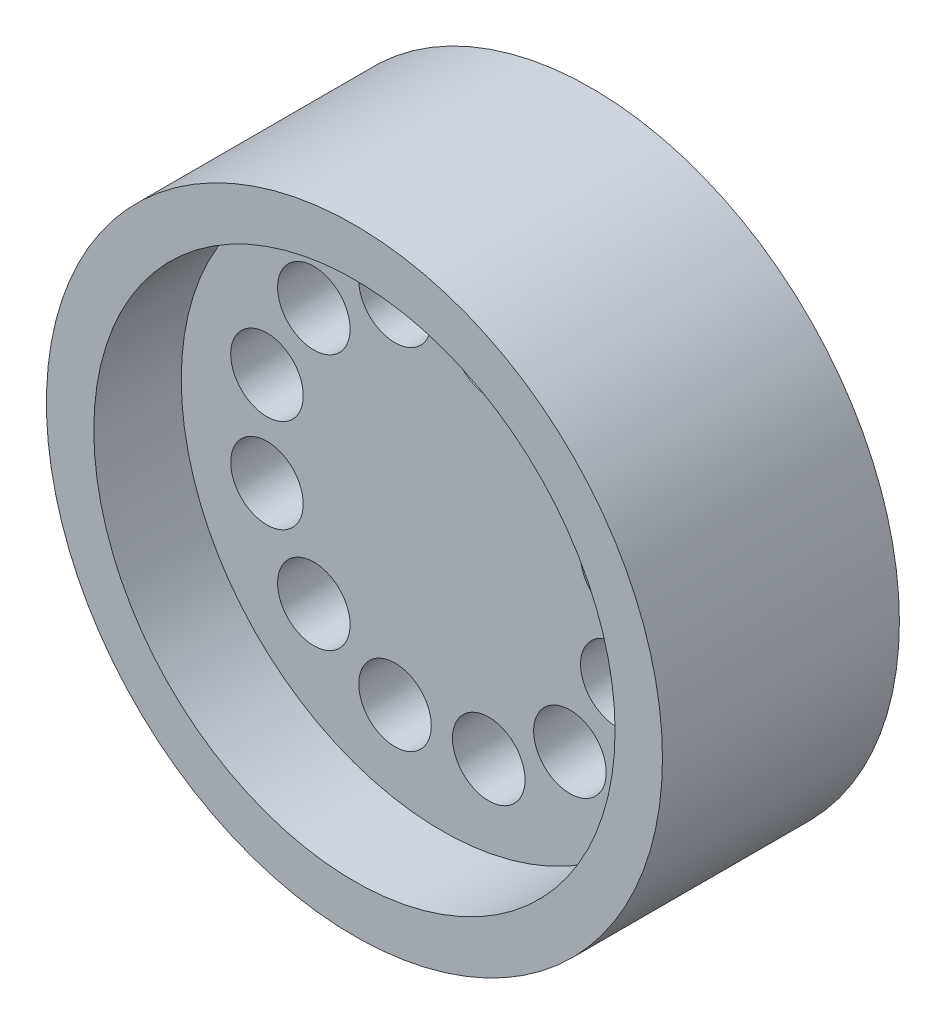
ISO-10303-21;
HEADER;
FILE_DESCRIPTION(('STEP AP214'),'2;1');
FILE_NAME('part.step','',(''),(''),'','','');
FILE_SCHEMA(('AUTOMOTIVE_DESIGN { 1 0 10303 214 1 1 1 1 }'));
ENDSEC;
DATA;
#1=APPLICATION_CONTEXT('core data for automotive mechanical design processes');
#2=APPLICATION_PROTOCOL_DEFINITION('international standard','automotive_design',2000,#1);
#3=PRODUCT_CONTEXT('',#1,'mechanical');
#4=PRODUCT('Part','Part','',(#3));
#5=PRODUCT_RELATED_PRODUCT_CATEGORY('part','',(#4));
#6=PRODUCT_DEFINITION_FORMATION('','',#4);
#7=PRODUCT_DEFINITION_CONTEXT('part definition',#1,'design');
#8=PRODUCT_DEFINITION('design','',#6,#7);
#9=PRODUCT_DEFINITION_SHAPE('','',#8);
#10=(LENGTH_UNIT() NAMED_UNIT(*) SI_UNIT(.MILLI.,.METRE.));
#11=(NAMED_UNIT(*) PLANE_ANGLE_UNIT() SI_UNIT($,.RADIAN.));
#12=(NAMED_UNIT(*) SI_UNIT($,.STERADIAN.) SOLID_ANGLE_UNIT());
#13=UNCERTAINTY_MEASURE_WITH_UNIT(LENGTH_MEASURE(1.E-05),#10,'distance_accuracy_value','');
#14=(GEOMETRIC_REPRESENTATION_CONTEXT(3) GLOBAL_UNCERTAINTY_ASSIGNED_CONTEXT((#13)) GLOBAL_UNIT_ASSIGNED_CONTEXT((#10,
#11,#12)) REPRESENTATION_CONTEXT('',''));
#15=CARTESIAN_POINT('',(0.,0.,0.));
#16=DIRECTION('',(0.,0.,1.));
#17=DIRECTION('',(1.,0.,0.));
#18=AXIS2_PLACEMENT_3D('',#15,#16,#17);
#19=CARTESIAN_POINT('',(0.,-13.75,14.4329896907217));
#20=DIRECTION('',(0.,0.,1.));
#21=DIRECTION('',(1.,0.,0.));
#22=AXIS2_PLACEMENT_3D('',#19,#20,#21);
#23=CYLINDRICAL_SURFACE('',#22,27.5);
#24=CARTESIAN_POINT('',(0.,-13.75,2.88659793814432));
#25=DIRECTION('',(0.,0.,1.));
#26=DIRECTION('',(1.,0.,0.));
#27=AXIS2_PLACEMENT_3D('',#24,#25,#26);
#28=CIRCLE('',#27,27.5);
#29=CARTESIAN_POINT('',(27.5,-13.75,2.88659793814432));
#30=VERTEX_POINT('',#29);
#31=EDGE_CURVE('E42',#30,#30,#28,.T.);
#32=ORIENTED_EDGE('',*,*,#31,.F.);
#33=EDGE_LOOP('',(#32));
#34=FACE_BOUND('',#33,.T.);
#35=CARTESIAN_POINT('',(0.,-13.75,12.1134020618557));
#36=DIRECTION('',(0.,0.,1.));
#37=DIRECTION('',(1.,0.,0.));
#38=AXIS2_PLACEMENT_3D('',#35,#36,#37);
#39=CIRCLE('',#38,27.5);
#40=CARTESIAN_POINT('',(27.5,-13.75,12.1134020618557));
#41=VERTEX_POINT('',#40);
#42=EDGE_CURVE('E61',#41,#41,#39,.T.);
#43=ORIENTED_EDGE('',*,*,#42,.T.);
#44=EDGE_LOOP('',(#43));
#45=FACE_BOUND('',#44,.T.);
#46=ADVANCED_FACE('F35',(#34,#45),#23,.F.);
#47=CARTESIAN_POINT('',(0.,0.,2.88659793814431));
#48=DIRECTION('',(0.,0.,1.));
#49=DIRECTION('',(1.,0.,0.));
#50=AXIS2_PLACEMENT_3D('',#47,#48,#49);
#51=PLANE('',#50);
#52=CARTESIAN_POINT('',(-13.5105738901882,-0.239426109811574,2.88659793814431));
#53=DIRECTION('',(0.,0.,1.));
#54=DIRECTION('',(1.,0.,0.));
#55=AXIS2_PLACEMENT_3D('',#52,#53,#54);
#56=CIRCLE('',#55,3.82719253221743);
#57=CARTESIAN_POINT('',(-9.68338135797081,-0.239426109811574,2.88659793814431));
#58=VERTEX_POINT('',#57);
#59=EDGE_CURVE('E64',#58,#58,#56,.T.);
#60=ORIENTED_EDGE('',*,*,#59,.F.);
#61=EDGE_LOOP('',(#60));
#62=FACE_BOUND('',#61,.T.);
#63=CARTESIAN_POINT('',(-18.455787153704,-8.80478673648423,2.88659793814431));
#64=DIRECTION('',(0.,0.,1.));
#65=DIRECTION('',(1.,0.,0.));
#66=AXIS2_PLACEMENT_3D('',#63,#64,#65);
#67=CIRCLE('',#66,3.82719253221743);
#68=CARTESIAN_POINT('',(-14.6285946214866,-8.80478673648423,2.88659793814431));
#69=VERTEX_POINT('',#68);
#70=EDGE_CURVE('E67',#69,#69,#67,.T.);
#71=ORIENTED_EDGE('',*,*,#70,.F.);
#72=EDGE_LOOP('',(#71));
#73=FACE_BOUND('',#72,.T.);
#74=CARTESIAN_POINT('',(-18.455787153704,-18.6952132635158,2.88659793814431));
#75=DIRECTION('',(0.,0.,1.));
#76=DIRECTION('',(1.,0.,0.));
#77=AXIS2_PLACEMENT_3D('',#74,#75,#76);
#78=CIRCLE('',#77,3.82719253221743);
#79=CARTESIAN_POINT('',(-14.6285946214866,-18.6952132635158,2.88659793814431));
#80=VERTEX_POINT('',#79);
#81=EDGE_CURVE('E70',#80,#80,#78,.T.);
#82=ORIENTED_EDGE('',*,*,#81,.F.);
#83=EDGE_LOOP('',(#82));
#84=FACE_BOUND('',#83,.T.);
#85=CARTESIAN_POINT('',(-13.5105738901882,-27.2605738901884,2.88659793814431));
#86=DIRECTION('',(0.,0.,1.));
#87=DIRECTION('',(1.,0.,0.));
#88=AXIS2_PLACEMENT_3D('',#85,#86,#87);
#89=CIRCLE('',#88,3.82719253221743);
#90=CARTESIAN_POINT('',(-9.68338135797081,-27.2605738901884,2.88659793814431));
#91=VERTEX_POINT('',#90);
#92=EDGE_CURVE('E73',#91,#91,#89,.T.);
#93=ORIENTED_EDGE('',*,*,#92,.F.);
#94=EDGE_LOOP('',(#93));
#95=FACE_BOUND('',#94,.T.);
#96=CARTESIAN_POINT('',(-4.94521326351555,-32.205787153704,2.88659793814431));
#97=DIRECTION('',(0.,0.,1.));
#98=DIRECTION('',(1.,0.,0.));
#99=AXIS2_PLACEMENT_3D('',#96,#97,#98);
#100=CIRCLE('',#99,3.82719253221744);
#101=CARTESIAN_POINT('',(-1.11802073129812,-32.205787153704,2.88659793814431));
#102=VERTEX_POINT('',#101);
#103=EDGE_CURVE('E76',#102,#102,#100,.T.);
#104=ORIENTED_EDGE('',*,*,#103,.F.);
#105=EDGE_LOOP('',(#104));
#106=FACE_BOUND('',#105,.T.);
#107=CARTESIAN_POINT('',(4.94521326351555,-32.205787153704,2.88659793814431));
#108=DIRECTION('',(0.,0.,1.));
#109=DIRECTION('',(1.,0.,0.));
#110=AXIS2_PLACEMENT_3D('',#107,#108,#109);
#111=CIRCLE('',#110,3.82719253221744);
#112=CARTESIAN_POINT('',(8.77240579573299,-32.205787153704,2.88659793814431));
#113=VERTEX_POINT('',#112);
#114=EDGE_CURVE('E79',#113,#113,#111,.T.);
#115=ORIENTED_EDGE('',*,*,#114,.F.);
#116=EDGE_LOOP('',(#115));
#117=FACE_BOUND('',#116,.T.);
#118=CARTESIAN_POINT('',(13.5105738901882,-27.2605738901884,2.88659793814431));
#119=DIRECTION('',(0.,0.,1.));
#120=DIRECTION('',(1.,0.,0.));
#121=AXIS2_PLACEMENT_3D('',#118,#119,#120);
#122=CIRCLE('',#121,3.82719253221743);
#123=CARTESIAN_POINT('',(17.3377664224057,-27.2605738901884,2.88659793814431));
#124=VERTEX_POINT('',#123);
#125=EDGE_CURVE('E82',#124,#124,#122,.T.);
#126=ORIENTED_EDGE('',*,*,#125,.F.);
#127=EDGE_LOOP('',(#126));
#128=FACE_BOUND('',#127,.T.);
#129=CARTESIAN_POINT('',(18.455787153704,-18.6952132635158,2.88659793814431));
#130=DIRECTION('',(0.,0.,1.));
#131=DIRECTION('',(1.,0.,0.));
#132=AXIS2_PLACEMENT_3D('',#129,#130,#131);
#133=CIRCLE('',#132,3.82719253221743);
#134=CARTESIAN_POINT('',(22.2829796859214,-18.6952132635158,2.88659793814431));
#135=VERTEX_POINT('',#134);
#136=EDGE_CURVE('E85',#135,#135,#133,.T.);
#137=ORIENTED_EDGE('',*,*,#136,.F.);
#138=EDGE_LOOP('',(#137));
#139=FACE_BOUND('',#138,.T.);
#140=CARTESIAN_POINT('',(18.455787153704,-8.80478673648423,2.88659793814431));
#141=DIRECTION('',(0.,0.,1.));
#142=DIRECTION('',(1.,0.,0.));
#143=AXIS2_PLACEMENT_3D('',#140,#141,#142);
#144=CIRCLE('',#143,3.82719253221743);
#145=CARTESIAN_POINT('',(22.2829796859214,-8.80478673648423,2.88659793814431));
#146=VERTEX_POINT('',#145);
#147=EDGE_CURVE('E88',#146,#146,#144,.T.);
#148=ORIENTED_EDGE('',*,*,#147,.F.);
#149=EDGE_LOOP('',(#148));
#150=FACE_BOUND('',#149,.T.);
#151=CARTESIAN_POINT('',(13.5105738901882,-0.239426109811574,2.88659793814431));
#152=DIRECTION('',(0.,0.,1.));
#153=DIRECTION('',(1.,0.,0.));
#154=AXIS2_PLACEMENT_3D('',#151,#152,#153);
#155=CIRCLE('',#154,3.82719253221743);
#156=CARTESIAN_POINT('',(17.3377664224057,-0.239426109811574,2.88659793814431));
#157=VERTEX_POINT('',#156);
#158=EDGE_CURVE('E91',#157,#157,#155,.T.);
#159=ORIENTED_EDGE('',*,*,#158,.F.);
#160=EDGE_LOOP('',(#159));
#161=FACE_BOUND('',#160,.T.);
#162=CARTESIAN_POINT('',(4.94521326351555,4.70578715370405,2.88659793814431));
#163=DIRECTION('',(0.,0.,1.));
#164=DIRECTION('',(1.,0.,0.));
#165=AXIS2_PLACEMENT_3D('',#162,#163,#164);
#166=CIRCLE('',#165,3.82719253221744);
#167=CARTESIAN_POINT('',(8.77240579573299,4.70578715370405,2.88659793814431));
#168=VERTEX_POINT('',#167);
#169=EDGE_CURVE('E94',#168,#168,#166,.T.);
#170=ORIENTED_EDGE('',*,*,#169,.F.);
#171=EDGE_LOOP('',(#170));
#172=FACE_BOUND('',#171,.T.);
#173=CARTESIAN_POINT('',(-4.94521326351555,4.70578715370405,2.88659793814431));
#174=DIRECTION('',(0.,0.,1.));
#175=DIRECTION('',(1.,0.,0.));
#176=AXIS2_PLACEMENT_3D('',#173,#174,#175);
#177=CIRCLE('',#176,3.82719253221744);
#178=CARTESIAN_POINT('',(-1.11802073129812,4.70578715370405,2.88659793814431));
#179=VERTEX_POINT('',#178);
#180=EDGE_CURVE('E97',#179,#179,#177,.T.);
#181=ORIENTED_EDGE('',*,*,#180,.F.);
#182=EDGE_LOOP('',(#181));
#183=FACE_BOUND('',#182,.T.);
#184=ORIENTED_EDGE('',*,*,#31,.T.);
#185=EDGE_LOOP('',(#184));
#186=FACE_BOUND('',#185,.T.);
#187=ADVANCED_FACE('F37',(#62,#73,#84,#95,#106,#117,#128,#139,#150,#161,#172,#183,#186),#51,.T.);
#188=CARTESIAN_POINT('',(0.,0.,-2.88659793814432));
#189=DIRECTION('',(0.,0.,1.));
#190=DIRECTION('',(1.,0.,0.));
#191=AXIS2_PLACEMENT_3D('',#188,#189,#190);
#192=PLANE('',#191);
#193=CARTESIAN_POINT('',(0.,-13.75,-2.88659793814432));
#194=DIRECTION('',(0.,0.,1.));
#195=DIRECTION('',(1.,0.,0.));
#196=AXIS2_PLACEMENT_3D('',#193,#194,#195);
#197=CIRCLE('',#196,2.5);
#198=CARTESIAN_POINT('',(2.5,-13.75,-2.88659793814432));
#199=VERTEX_POINT('',#198);
#200=EDGE_CURVE('E10',#199,#199,#197,.F.);
#201=ORIENTED_EDGE('',*,*,#200,.F.);
#202=EDGE_LOOP('',(#201));
#203=FACE_BOUND('',#202,.T.);
#204=CARTESIAN_POINT('',(-13.5105738901882,-0.239426109811574,-2.88659793814432));
#205=DIRECTION('',(0.,0.,-1.));
#206=DIRECTION('',(1.,0.,0.));
#207=AXIS2_PLACEMENT_3D('',#204,#205,#206);
#208=CIRCLE('',#207,3.82719253221743);
#209=CARTESIAN_POINT('',(-9.68338135797081,-0.239426109811574,-2.88659793814432));
#210=VERTEX_POINT('',#209);
#211=EDGE_CURVE('E103',#210,#210,#208,.T.);
#212=ORIENTED_EDGE('',*,*,#211,.F.);
#213=EDGE_LOOP('',(#212));
#214=FACE_BOUND('',#213,.T.);
#215=CARTESIAN_POINT('',(-18.455787153704,-8.80478673648423,-2.88659793814432));
#216=DIRECTION('',(0.,0.,-1.));
#217=DIRECTION('',(-1.,0.,0.));
#218=AXIS2_PLACEMENT_3D('',#215,#216,#217);
#219=CIRCLE('',#218,3.82719253221743);
#220=CARTESIAN_POINT('',(-22.2829796859214,-8.80478673648423,-2.88659793814432));
#221=VERTEX_POINT('',#220);
#222=EDGE_CURVE('E123',#221,#221,#219,.T.);
#223=ORIENTED_EDGE('',*,*,#222,.F.);
#224=EDGE_LOOP('',(#223));
#225=FACE_BOUND('',#224,.T.);
#226=CARTESIAN_POINT('',(-18.455787153704,-18.6952132635158,-2.88659793814432));
#227=DIRECTION('',(0.,0.,-1.));
#228=DIRECTION('',(1.,0.,0.));
#229=AXIS2_PLACEMENT_3D('',#226,#227,#228);
#230=CIRCLE('',#229,3.82719253221743);
#231=CARTESIAN_POINT('',(-14.6285946214866,-18.6952132635158,-2.88659793814432));
#232=VERTEX_POINT('',#231);
#233=EDGE_CURVE('E120',#232,#232,#230,.T.);
#234=ORIENTED_EDGE('',*,*,#233,.F.);
#235=EDGE_LOOP('',(#234));
#236=FACE_BOUND('',#235,.T.);
#237=CARTESIAN_POINT('',(-13.5105738901882,-27.2605738901884,-2.88659793814432));
#238=DIRECTION('',(0.,0.,-1.));
#239=DIRECTION('',(-1.,0.,0.));
#240=AXIS2_PLACEMENT_3D('',#237,#238,#239);
#241=CIRCLE('',#240,3.82719253221743);
#242=CARTESIAN_POINT('',(-17.3377664224057,-27.2605738901884,-2.88659793814432));
#243=VERTEX_POINT('',#242);
#244=EDGE_CURVE('E117',#243,#243,#241,.T.);
#245=ORIENTED_EDGE('',*,*,#244,.F.);
#246=EDGE_LOOP('',(#245));
#247=FACE_BOUND('',#246,.T.);
#248=CARTESIAN_POINT('',(-4.94521326351555,-32.205787153704,-2.88659793814432));
#249=DIRECTION('',(0.,0.,-1.));
#250=DIRECTION('',(1.,0.,0.));
#251=AXIS2_PLACEMENT_3D('',#248,#249,#250);
#252=CIRCLE('',#251,3.82719253221744);
#253=CARTESIAN_POINT('',(-1.11802073129812,-32.205787153704,-2.88659793814432));
#254=VERTEX_POINT('',#253);
#255=EDGE_CURVE('E114',#254,#254,#252,.T.);
#256=ORIENTED_EDGE('',*,*,#255,.F.);
#257=EDGE_LOOP('',(#256));
#258=FACE_BOUND('',#257,.T.);
#259=CARTESIAN_POINT('',(4.94521326351555,-32.205787153704,-2.88659793814432));
#260=DIRECTION('',(0.,0.,-1.));
#261=DIRECTION('',(-1.,0.,0.));
#262=AXIS2_PLACEMENT_3D('',#259,#260,#261);
#263=CIRCLE('',#262,3.82719253221744);
#264=CARTESIAN_POINT('',(1.11802073129812,-32.205787153704,-2.88659793814432));
#265=VERTEX_POINT('',#264);
#266=EDGE_CURVE('E111',#265,#265,#263,.T.);
#267=ORIENTED_EDGE('',*,*,#266,.F.);
#268=EDGE_LOOP('',(#267));
#269=FACE_BOUND('',#268,.T.);
#270=CARTESIAN_POINT('',(13.5105738901882,-27.2605738901884,-2.88659793814432));
#271=DIRECTION('',(0.,0.,-1.));
#272=DIRECTION('',(1.,0.,0.));
#273=AXIS2_PLACEMENT_3D('',#270,#271,#272);
#274=CIRCLE('',#273,3.82719253221743);
#275=CARTESIAN_POINT('',(17.3377664224057,-27.2605738901884,-2.88659793814432));
#276=VERTEX_POINT('',#275);
#277=EDGE_CURVE('E107',#276,#276,#274,.T.);
#278=ORIENTED_EDGE('',*,*,#277,.F.);
#279=EDGE_LOOP('',(#278));
#280=FACE_BOUND('',#279,.T.);
#281=CARTESIAN_POINT('',(18.455787153704,-18.6952132635158,-2.88659793814432));
#282=DIRECTION('',(0.,0.,-1.));
#283=DIRECTION('',(-1.,0.,0.));
#284=AXIS2_PLACEMENT_3D('',#281,#282,#283);
#285=CIRCLE('',#284,3.82719253221743);
#286=CARTESIAN_POINT('',(14.6285946214866,-18.6952132635158,-2.88659793814432));
#287=VERTEX_POINT('',#286);
#288=EDGE_CURVE('E104',#287,#287,#285,.T.);
#289=ORIENTED_EDGE('',*,*,#288,.F.);
#290=EDGE_LOOP('',(#289));
#291=FACE_BOUND('',#290,.T.);
#292=CARTESIAN_POINT('',(18.455787153704,-8.80478673648423,-2.88659793814432));
#293=DIRECTION('',(0.,0.,-1.));
#294=DIRECTION('',(1.,0.,0.));
#295=AXIS2_PLACEMENT_3D('',#292,#293,#294);
#296=CIRCLE('',#295,3.82719253221743);
#297=CARTESIAN_POINT('',(22.2829796859214,-8.80478673648423,-2.88659793814432));
#298=VERTEX_POINT('',#297);
#299=EDGE_CURVE('E108',#298,#298,#296,.T.);
#300=ORIENTED_EDGE('',*,*,#299,.F.);
#301=EDGE_LOOP('',(#300));
#302=FACE_BOUND('',#301,.T.);
#303=CARTESIAN_POINT('',(13.5105738901882,-0.239426109811574,-2.88659793814432));
#304=DIRECTION('',(0.,0.,-1.));
#305=DIRECTION('',(-1.,0.,0.));
#306=AXIS2_PLACEMENT_3D('',#303,#304,#305);
#307=CIRCLE('',#306,3.82719253221743);
#308=CARTESIAN_POINT('',(9.68338135797081,-0.239426109811574,-2.88659793814432));
#309=VERTEX_POINT('',#308);
#310=EDGE_CURVE('E131',#309,#309,#307,.T.);
#311=ORIENTED_EDGE('',*,*,#310,.F.);
#312=EDGE_LOOP('',(#311));
#313=FACE_BOUND('',#312,.T.);
#314=CARTESIAN_POINT('',(4.94521326351555,4.70578715370405,-2.88659793814432));
#315=DIRECTION('',(0.,0.,-1.));
#316=DIRECTION('',(1.,0.,0.));
#317=AXIS2_PLACEMENT_3D('',#314,#315,#316);
#318=CIRCLE('',#317,3.82719253221744);
#319=CARTESIAN_POINT('',(8.77240579573299,4.70578715370405,-2.88659793814432));
#320=VERTEX_POINT('',#319);
#321=EDGE_CURVE('E128',#320,#320,#318,.T.);
#322=ORIENTED_EDGE('',*,*,#321,.F.);
#323=EDGE_LOOP('',(#322));
#324=FACE_BOUND('',#323,.T.);
#325=CARTESIAN_POINT('',(-4.94521326351555,4.70578715370405,-2.88659793814432));
#326=DIRECTION('',(0.,0.,-1.));
#327=DIRECTION('',(-1.,0.,0.));
#328=AXIS2_PLACEMENT_3D('',#325,#326,#327);
#329=CIRCLE('',#328,3.82719253221744);
#330=CARTESIAN_POINT('',(-8.77240579573299,4.70578715370405,-2.88659793814432));
#331=VERTEX_POINT('',#330);
#332=EDGE_CURVE('E100',#331,#331,#329,.T.);
#333=ORIENTED_EDGE('',*,*,#332,.F.);
#334=EDGE_LOOP('',(#333));
#335=FACE_BOUND('',#334,.T.);
#336=CARTESIAN_POINT('',(0.,-13.75,-2.88659793814432));
#337=DIRECTION('',(0.,0.,1.));
#338=DIRECTION('',(1.,0.,0.));
#339=AXIS2_PLACEMENT_3D('',#336,#337,#338);
#340=CIRCLE('',#339,27.5);
#341=CARTESIAN_POINT('',(27.5,-13.75,-2.88659793814432));
#342=VERTEX_POINT('',#341);
#343=EDGE_CURVE('E46',#342,#342,#340,.T.);
#344=ORIENTED_EDGE('',*,*,#343,.F.);
#345=EDGE_LOOP('',(#344));
#346=FACE_BOUND('',#345,.T.);
#347=ADVANCED_FACE('F162',(#203,#214,#225,#236,#247,#258,#269,#280,#291,#302,#313,#324,#335,
#346),#192,.F.);
#348=CARTESIAN_POINT('',(0.,-13.75,-12.8865979381443));
#349=DIRECTION('',(0.,0.,1.));
#350=DIRECTION('',(1.,0.,0.));
#351=AXIS2_PLACEMENT_3D('',#348,#349,#350);
#352=CIRCLE('',#351,27.5);
#353=CARTESIAN_POINT('',(27.5,-13.75,-12.8865979381443));
#354=VERTEX_POINT('',#353);
#355=EDGE_CURVE('E50',#354,#354,#352,.T.);
#356=ORIENTED_EDGE('',*,*,#355,.F.);
#357=EDGE_LOOP('',(#356));
#358=FACE_BOUND('',#357,.T.);
#359=ORIENTED_EDGE('',*,*,#343,.T.);
#360=EDGE_LOOP('',(#359));
#361=FACE_BOUND('',#360,.T.);
#362=ADVANCED_FACE('F158',(#358,#361),#23,.F.);
#363=CARTESIAN_POINT('',(0.,0.,-12.8865979381443));
#364=DIRECTION('',(0.,0.,1.));
#365=DIRECTION('',(1.,0.,0.));
#366=AXIS2_PLACEMENT_3D('',#363,#364,#365);
#367=PLANE('',#366);
#368=CARTESIAN_POINT('',(0.,-13.75,-12.8865979381443));
#369=DIRECTION('',(0.,0.,1.));
#370=DIRECTION('',(1.,0.,0.));
#371=AXIS2_PLACEMENT_3D('',#368,#369,#370);
#372=CIRCLE('',#371,32.5);
#373=CARTESIAN_POINT('',(32.5,-13.75,-12.8865979381443));
#374=VERTEX_POINT('',#373);
#375=EDGE_CURVE('E55',#374,#374,#372,.T.);
#376=ORIENTED_EDGE('',*,*,#375,.F.);
#377=EDGE_LOOP('',(#376));
#378=FACE_BOUND('',#377,.T.);
#379=ORIENTED_EDGE('',*,*,#355,.T.);
#380=EDGE_LOOP('',(#379));
#381=FACE_BOUND('',#380,.T.);
#382=ADVANCED_FACE('F167',(#378,#381),#367,.F.);
#383=CARTESIAN_POINT('',(0.,-13.75,14.4329896907217));
#384=DIRECTION('',(0.,0.,1.));
#385=DIRECTION('',(1.,0.,0.));
#386=AXIS2_PLACEMENT_3D('',#383,#384,#385);
#387=CYLINDRICAL_SURFACE('',#386,32.5);
#388=ORIENTED_EDGE('',*,*,#375,.T.);
#389=EDGE_LOOP('',(#388));
#390=FACE_BOUND('',#389,.T.);
#391=CARTESIAN_POINT('',(0.,-13.75,12.1134020618557));
#392=DIRECTION('',(0.,0.,1.));
#393=DIRECTION('',(1.,0.,0.));
#394=AXIS2_PLACEMENT_3D('',#391,#392,#393);
#395=CIRCLE('',#394,32.5);
#396=CARTESIAN_POINT('',(32.5,-13.75,12.1134020618557));
#397=VERTEX_POINT('',#396);
#398=EDGE_CURVE('E58',#397,#397,#395,.T.);
#399=ORIENTED_EDGE('',*,*,#398,.F.);
#400=EDGE_LOOP('',(#399));
#401=FACE_BOUND('',#400,.T.);
#402=ADVANCED_FACE('F173',(#390,#401),#387,.T.);
#403=CARTESIAN_POINT('',(0.,0.,12.1134020618557));
#404=DIRECTION('',(0.,0.,1.));
#405=DIRECTION('',(1.,0.,0.));
#406=AXIS2_PLACEMENT_3D('',#403,#404,#405);
#407=PLANE('',#406);
#408=ORIENTED_EDGE('',*,*,#398,.T.);
#409=EDGE_LOOP('',(#408));
#410=FACE_BOUND('',#409,.T.);
#411=ORIENTED_EDGE('',*,*,#42,.F.);
#412=EDGE_LOOP('',(#411));
#413=FACE_BOUND('',#412,.T.);
#414=ADVANCED_FACE('F211',(#410,#413),#407,.T.);
#415=CARTESIAN_POINT('',(-4.94521326351555,4.70578715370405,7.11340206185568));
#416=DIRECTION('',(0.,0.,-1.));
#417=DIRECTION('',(-1.,0.,0.));
#418=AXIS2_PLACEMENT_3D('',#415,#416,#417);
#419=CYLINDRICAL_SURFACE('',#418,3.82719253221744);
#420=ORIENTED_EDGE('',*,*,#180,.T.);
#421=EDGE_LOOP('',(#420));
#422=FACE_BOUND('',#421,.T.);
#423=ORIENTED_EDGE('',*,*,#332,.T.);
#424=EDGE_LOOP('',(#423));
#425=FACE_BOUND('',#424,.T.);
#426=ADVANCED_FACE('F208',(#422,#425),#419,.F.);
#427=CARTESIAN_POINT('',(4.94521326351555,4.70578715370405,7.11340206185568));
#428=DIRECTION('',(0.,0.,-1.));
#429=DIRECTION('',(-1.,0.,0.));
#430=AXIS2_PLACEMENT_3D('',#427,#428,#429);
#431=CYLINDRICAL_SURFACE('',#430,3.82719253221744);
#432=ORIENTED_EDGE('',*,*,#169,.T.);
#433=EDGE_LOOP('',(#432));
#434=FACE_BOUND('',#433,.T.);
#435=ORIENTED_EDGE('',*,*,#321,.T.);
#436=EDGE_LOOP('',(#435));
#437=FACE_BOUND('',#436,.T.);
#438=ADVANCED_FACE('F210',(#434,#437),#431,.F.);
#439=CARTESIAN_POINT('',(13.5105738901882,-0.239426109811574,7.11340206185568));
#440=DIRECTION('',(0.,0.,-1.));
#441=DIRECTION('',(-1.,0.,0.));
#442=AXIS2_PLACEMENT_3D('',#439,#440,#441);
#443=CYLINDRICAL_SURFACE('',#442,3.82719253221743);
#444=ORIENTED_EDGE('',*,*,#158,.T.);
#445=EDGE_LOOP('',(#444));
#446=FACE_BOUND('',#445,.T.);
#447=ORIENTED_EDGE('',*,*,#310,.T.);
#448=EDGE_LOOP('',(#447));
#449=FACE_BOUND('',#448,.T.);
#450=ADVANCED_FACE('F218',(#446,#449),#443,.F.);
#451=CARTESIAN_POINT('',(18.455787153704,-8.80478673648423,7.11340206185568));
#452=DIRECTION('',(0.,0.,-1.));
#453=DIRECTION('',(-1.,0.,0.));
#454=AXIS2_PLACEMENT_3D('',#451,#452,#453);
#455=CYLINDRICAL_SURFACE('',#454,3.82719253221743);
#456=ORIENTED_EDGE('',*,*,#147,.T.);
#457=EDGE_LOOP('',(#456));
#458=FACE_BOUND('',#457,.T.);
#459=ORIENTED_EDGE('',*,*,#299,.T.);
#460=EDGE_LOOP('',(#459));
#461=FACE_BOUND('',#460,.T.);
#462=ADVANCED_FACE('F269',(#458,#461),#455,.F.);
#463=CARTESIAN_POINT('',(18.455787153704,-18.6952132635158,7.11340206185568));
#464=DIRECTION('',(0.,0.,-1.));
#465=DIRECTION('',(-1.,0.,0.));
#466=AXIS2_PLACEMENT_3D('',#463,#464,#465);
#467=CYLINDRICAL_SURFACE('',#466,3.82719253221743);
#468=ORIENTED_EDGE('',*,*,#136,.T.);
#469=EDGE_LOOP('',(#468));
#470=FACE_BOUND('',#469,.T.);
#471=ORIENTED_EDGE('',*,*,#288,.T.);
#472=EDGE_LOOP('',(#471));
#473=FACE_BOUND('',#472,.T.);
#474=ADVANCED_FACE('F224',(#470,#473),#467,.F.);
#475=CARTESIAN_POINT('',(13.5105738901882,-27.2605738901884,7.11340206185568));
#476=DIRECTION('',(0.,0.,-1.));
#477=DIRECTION('',(-1.,0.,0.));
#478=AXIS2_PLACEMENT_3D('',#475,#476,#477);
#479=CYLINDRICAL_SURFACE('',#478,3.82719253221743);
#480=ORIENTED_EDGE('',*,*,#125,.T.);
#481=EDGE_LOOP('',(#480));
#482=FACE_BOUND('',#481,.T.);
#483=ORIENTED_EDGE('',*,*,#277,.T.);
#484=EDGE_LOOP('',(#483));
#485=FACE_BOUND('',#484,.T.);
#486=ADVANCED_FACE('F287',(#482,#485),#479,.F.);
#487=CARTESIAN_POINT('',(4.94521326351555,-32.205787153704,7.11340206185568));
#488=DIRECTION('',(0.,0.,-1.));
#489=DIRECTION('',(-1.,0.,0.));
#490=AXIS2_PLACEMENT_3D('',#487,#488,#489);
#491=CYLINDRICAL_SURFACE('',#490,3.82719253221744);
#492=ORIENTED_EDGE('',*,*,#114,.T.);
#493=EDGE_LOOP('',(#492));
#494=FACE_BOUND('',#493,.T.);
#495=ORIENTED_EDGE('',*,*,#266,.T.);
#496=EDGE_LOOP('',(#495));
#497=FACE_BOUND('',#496,.T.);
#498=ADVANCED_FACE('F296',(#494,#497),#491,.F.);
#499=CARTESIAN_POINT('',(-4.94521326351555,-32.205787153704,7.11340206185568));
#500=DIRECTION('',(0.,0.,-1.));
#501=DIRECTION('',(-1.,0.,0.));
#502=AXIS2_PLACEMENT_3D('',#499,#500,#501);
#503=CYLINDRICAL_SURFACE('',#502,3.82719253221744);
#504=ORIENTED_EDGE('',*,*,#103,.T.);
#505=EDGE_LOOP('',(#504));
#506=FACE_BOUND('',#505,.T.);
#507=ORIENTED_EDGE('',*,*,#255,.T.);
#508=EDGE_LOOP('',(#507));
#509=FACE_BOUND('',#508,.T.);
#510=ADVANCED_FACE('F305',(#506,#509),#503,.F.);
#511=CARTESIAN_POINT('',(-13.5105738901882,-27.2605738901884,7.11340206185568));
#512=DIRECTION('',(0.,0.,-1.));
#513=DIRECTION('',(-1.,0.,0.));
#514=AXIS2_PLACEMENT_3D('',#511,#512,#513);
#515=CYLINDRICAL_SURFACE('',#514,3.82719253221743);
#516=ORIENTED_EDGE('',*,*,#92,.T.);
#517=EDGE_LOOP('',(#516));
#518=FACE_BOUND('',#517,.T.);
#519=ORIENTED_EDGE('',*,*,#244,.T.);
#520=EDGE_LOOP('',(#519));
#521=FACE_BOUND('',#520,.T.);
#522=ADVANCED_FACE('F315',(#518,#521),#515,.F.);
#523=CARTESIAN_POINT('',(-18.455787153704,-18.6952132635158,7.11340206185568));
#524=DIRECTION('',(0.,0.,-1.));
#525=DIRECTION('',(-1.,0.,0.));
#526=AXIS2_PLACEMENT_3D('',#523,#524,#525);
#527=CYLINDRICAL_SURFACE('',#526,3.82719253221743);
#528=ORIENTED_EDGE('',*,*,#81,.T.);
#529=EDGE_LOOP('',(#528));
#530=FACE_BOUND('',#529,.T.);
#531=ORIENTED_EDGE('',*,*,#233,.T.);
#532=EDGE_LOOP('',(#531));
#533=FACE_BOUND('',#532,.T.);
#534=ADVANCED_FACE('F325',(#530,#533),#527,.F.);
#535=CARTESIAN_POINT('',(-18.455787153704,-8.80478673648423,7.11340206185568));
#536=DIRECTION('',(0.,0.,-1.));
#537=DIRECTION('',(-1.,0.,0.));
#538=AXIS2_PLACEMENT_3D('',#535,#536,#537);
#539=CYLINDRICAL_SURFACE('',#538,3.82719253221743);
#540=ORIENTED_EDGE('',*,*,#70,.T.);
#541=EDGE_LOOP('',(#540));
#542=FACE_BOUND('',#541,.T.);
#543=ORIENTED_EDGE('',*,*,#222,.T.);
#544=EDGE_LOOP('',(#543));
#545=FACE_BOUND('',#544,.T.);
#546=ADVANCED_FACE('F151',(#542,#545),#539,.F.);
#547=CARTESIAN_POINT('',(-13.5105738901882,-0.239426109811574,7.11340206185568));
#548=DIRECTION('',(0.,0.,-1.));
#549=DIRECTION('',(-1.,0.,0.));
#550=AXIS2_PLACEMENT_3D('',#547,#548,#549);
#551=CYLINDRICAL_SURFACE('',#550,3.82719253221743);
#552=ORIENTED_EDGE('',*,*,#59,.T.);
#553=EDGE_LOOP('',(#552));
#554=FACE_BOUND('',#553,.T.);
#555=ORIENTED_EDGE('',*,*,#211,.T.);
#556=EDGE_LOOP('',(#555));
#557=FACE_BOUND('',#556,.T.);
#558=ADVANCED_FACE('F144',(#554,#557),#551,.F.);
#559=CARTESIAN_POINT('',(0.,-13.75,-32.8865979381443));
#560=DIRECTION('',(0.,0.,1.));
#561=DIRECTION('',(1.,0.,0.));
#562=AXIS2_PLACEMENT_3D('',#559,#560,#561);
#563=CYLINDRICAL_SURFACE('',#562,2.5);
#564=CARTESIAN_POINT('',(0.,-13.75,-32.8865979381443));
#565=DIRECTION('',(0.,0.,-1.));
#566=DIRECTION('',(-1.,0.,0.));
#567=AXIS2_PLACEMENT_3D('',#564,#565,#566);
#568=CIRCLE('',#567,2.5);
#569=CARTESIAN_POINT('',(-2.5,-13.75,-32.8865979381443));
#570=VERTEX_POINT('',#569);
#571=EDGE_CURVE('E132',#570,#570,#568,.T.);
#572=ORIENTED_EDGE('',*,*,#571,.F.);
#573=EDGE_LOOP('',(#572));
#574=FACE_BOUND('',#573,.T.);
#575=ORIENTED_EDGE('',*,*,#200,.T.);
#576=EDGE_LOOP('',(#575));
#577=FACE_BOUND('',#576,.T.);
#578=ADVANCED_FACE('F142',(#574,#577),#563,.T.);
#579=CARTESIAN_POINT('',(0.,-13.75,-32.8865979381443));
#580=DIRECTION('',(0.,0.,-1.));
#581=DIRECTION('',(-1.,0.,0.));
#582=AXIS2_PLACEMENT_3D('',#579,#580,#581);
#583=PLANE('',#582);
#584=ORIENTED_EDGE('',*,*,#571,.T.);
#585=EDGE_LOOP('',(#584));
#586=FACE_BOUND('',#585,.T.);
#587=ADVANCED_FACE('F140',(#586),#583,.T.);
#588=CLOSED_SHELL('',(#46,#187,#347,#362,#382,#402,#414,#426,#438,#450,#462,#474,#486,#498,#510,
#522,#534,#546,#558,#578,#587));
#589=MANIFOLD_SOLID_BREP('B2',#588);
#590=ADVANCED_BREP_SHAPE_REPRESENTATION('',(#18,#589),#14);
#591=SHAPE_DEFINITION_REPRESENTATION(#9,#590);
ENDSEC;
END-ISO-10303-21;
